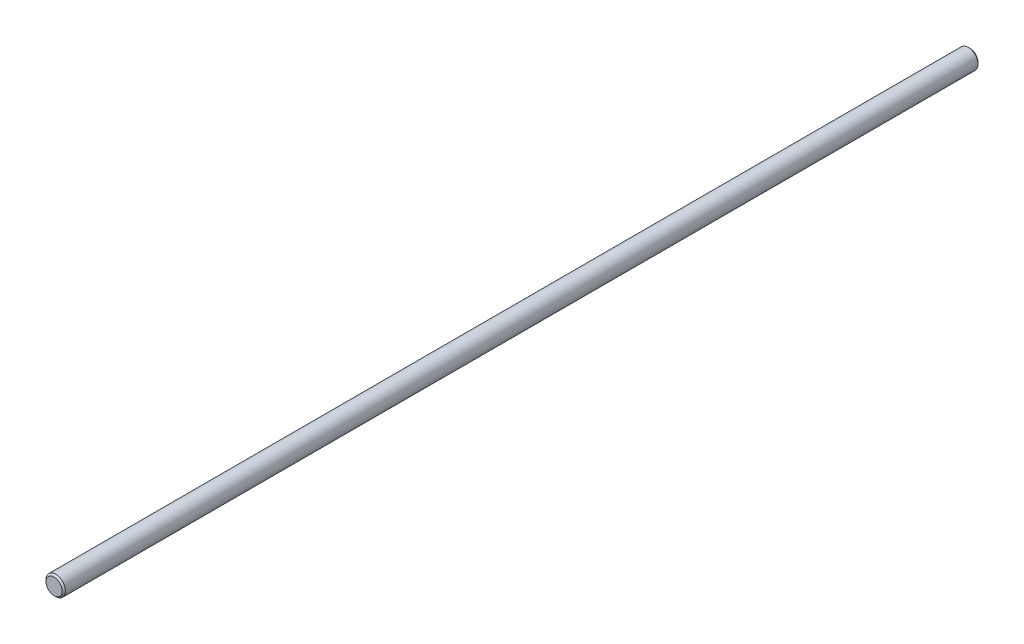
ISO-10303-21;
HEADER;
FILE_DESCRIPTION(('STEP AP214'),'2;1');
FILE_NAME('part.step','',(''),(''),'','','');
FILE_SCHEMA(('AUTOMOTIVE_DESIGN { 1 0 10303 214 1 1 1 1 }'));
ENDSEC;
DATA;
#1=APPLICATION_CONTEXT('core data for automotive mechanical design processes');
#2=APPLICATION_PROTOCOL_DEFINITION('international standard','automotive_design',2000,#1);
#3=PRODUCT_CONTEXT('',#1,'mechanical');
#4=PRODUCT('Part','Part','',(#3));
#5=PRODUCT_RELATED_PRODUCT_CATEGORY('part','',(#4));
#6=PRODUCT_DEFINITION_FORMATION('','',#4);
#7=PRODUCT_DEFINITION_CONTEXT('part definition',#1,'design');
#8=PRODUCT_DEFINITION('design','',#6,#7);
#9=PRODUCT_DEFINITION_SHAPE('','',#8);
#10=(LENGTH_UNIT() NAMED_UNIT(*) SI_UNIT(.MILLI.,.METRE.));
#11=(NAMED_UNIT(*) PLANE_ANGLE_UNIT() SI_UNIT($,.RADIAN.));
#12=(NAMED_UNIT(*) SI_UNIT($,.STERADIAN.) SOLID_ANGLE_UNIT());
#13=UNCERTAINTY_MEASURE_WITH_UNIT(LENGTH_MEASURE(1.E-05),#10,'distance_accuracy_value','');
#14=(GEOMETRIC_REPRESENTATION_CONTEXT(3) GLOBAL_UNCERTAINTY_ASSIGNED_CONTEXT((#13)) GLOBAL_UNIT_ASSIGNED_CONTEXT((#10,
#11,#12)) REPRESENTATION_CONTEXT('',''));
#15=CARTESIAN_POINT('',(0.,0.,0.));
#16=DIRECTION('',(0.,0.,1.));
#17=DIRECTION('',(1.,0.,0.));
#18=AXIS2_PLACEMENT_3D('',#15,#16,#17);
#19=CARTESIAN_POINT('',(0.,0.,141.25));
#20=DIRECTION('',(0.,0.,-1.));
#21=DIRECTION('',(-1.,0.,0.));
#22=AXIS2_PLACEMENT_3D('',#19,#20,#21);
#23=CYLINDRICAL_SURFACE('',#22,3.);
#24=CARTESIAN_POINT('',(0.,0.,-140.75));
#25=DIRECTION('',(0.,0.,1.));
#26=DIRECTION('',(1.,0.,0.));
#27=AXIS2_PLACEMENT_3D('',#24,#25,#26);
#28=CIRCLE('',#27,3.);
#29=CARTESIAN_POINT('',(3.,0.,-140.75));
#30=VERTEX_POINT('',#29);
#31=EDGE_CURVE('E52',#30,#30,#28,.T.);
#32=ORIENTED_EDGE('',*,*,#31,.T.);
#33=EDGE_LOOP('',(#32));
#34=FACE_BOUND('',#33,.T.);
#35=CARTESIAN_POINT('',(0.,0.,140.75));
#36=DIRECTION('',(0.,0.,1.));
#37=DIRECTION('',(1.,0.,0.));
#38=AXIS2_PLACEMENT_3D('',#35,#36,#37);
#39=CIRCLE('',#38,3.);
#40=CARTESIAN_POINT('',(3.,0.,140.75));
#41=VERTEX_POINT('',#40);
#42=EDGE_CURVE('E60',#41,#41,#39,.F.);
#43=ORIENTED_EDGE('',*,*,#42,.T.);
#44=EDGE_LOOP('',(#43));
#45=FACE_BOUND('',#44,.T.);
#46=ADVANCED_FACE('F41',(#34,#45),#23,.T.);
#47=CARTESIAN_POINT('',(0.,0.,141.25));
#48=DIRECTION('',(0.,0.,1.));
#49=DIRECTION('',(1.,0.,0.));
#50=AXIS2_PLACEMENT_3D('',#47,#48,#49);
#51=PLANE('',#50);
#52=CARTESIAN_POINT('',(0.,0.,141.25));
#53=DIRECTION('',(0.,0.,1.));
#54=DIRECTION('',(1.,0.,0.));
#55=AXIS2_PLACEMENT_3D('',#52,#53,#54);
#56=CIRCLE('',#55,2.50000000000009);
#57=CARTESIAN_POINT('',(2.50000000000009,0.,141.25));
#58=VERTEX_POINT('',#57);
#59=EDGE_CURVE('E10',#58,#58,#56,.T.);
#60=ORIENTED_EDGE('',*,*,#59,.T.);
#61=EDGE_LOOP('',(#60));
#62=FACE_BOUND('',#61,.T.);
#63=ADVANCED_FACE('F75',(#62),#51,.T.);
#64=CARTESIAN_POINT('',(0.,0.,-141.25));
#65=DIRECTION('',(0.,0.,1.));
#66=DIRECTION('',(1.,0.,0.));
#67=AXIS2_PLACEMENT_3D('',#64,#65,#66);
#68=PLANE('',#67);
#69=CARTESIAN_POINT('',(0.,0.,-141.25));
#70=DIRECTION('',(0.,0.,1.));
#71=DIRECTION('',(1.,0.,0.));
#72=AXIS2_PLACEMENT_3D('',#69,#70,#71);
#73=CIRCLE('',#72,2.49999999999997);
#74=CARTESIAN_POINT('',(2.49999999999997,0.,-141.25));
#75=VERTEX_POINT('',#74);
#76=EDGE_CURVE('E47',#75,#75,#73,.F.);
#77=ORIENTED_EDGE('',*,*,#76,.T.);
#78=EDGE_LOOP('',(#77));
#79=FACE_BOUND('',#78,.T.);
#80=ADVANCED_FACE('F68',(#79),#68,.F.);
#81=CARTESIAN_POINT('',(0.,0.,-140.75));
#82=DIRECTION('',(0.,0.,1.));
#83=DIRECTION('',(1.,0.,0.));
#84=AXIS2_PLACEMENT_3D('',#81,#82,#83);
#85=CONICAL_SURFACE('',#84,3.,0.785398163397418);
#86=ORIENTED_EDGE('',*,*,#76,.F.);
#87=EDGE_LOOP('',(#86));
#88=FACE_BOUND('',#87,.T.);
#89=ORIENTED_EDGE('',*,*,#31,.F.);
#90=EDGE_LOOP('',(#89));
#91=FACE_BOUND('',#90,.T.);
#92=ADVANCED_FACE('F67',(#88,#91),#85,.T.);
#93=CARTESIAN_POINT('',(0.,0.,141.25));
#94=DIRECTION('',(0.,0.,-1.));
#95=DIRECTION('',(-1.,0.,0.));
#96=AXIS2_PLACEMENT_3D('',#93,#94,#95);
#97=CONICAL_SURFACE('',#96,2.50000000000009,0.785398163397445);
#98=ORIENTED_EDGE('',*,*,#42,.F.);
#99=EDGE_LOOP('',(#98));
#100=FACE_BOUND('',#99,.T.);
#101=ORIENTED_EDGE('',*,*,#59,.F.);
#102=EDGE_LOOP('',(#101));
#103=FACE_BOUND('',#102,.T.);
#104=ADVANCED_FACE('F42',(#100,#103),#97,.T.);
#105=CLOSED_SHELL('',(#46,#63,#80,#92,#104));
#106=MANIFOLD_SOLID_BREP('B2',#105);
#107=ADVANCED_BREP_SHAPE_REPRESENTATION('',(#18,#106),#14);
#108=SHAPE_DEFINITION_REPRESENTATION(#9,#107);
ENDSEC;
END-ISO-10303-21;
